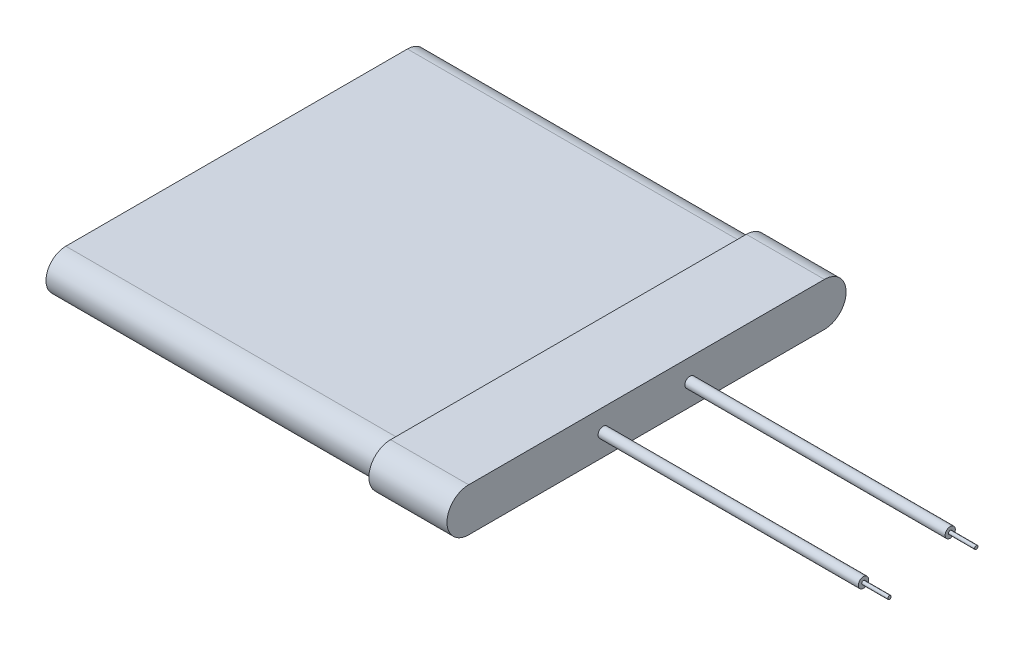
ISO-10303-21;
HEADER;
FILE_DESCRIPTION(('STEP AP214'),'2;1');
FILE_NAME('part.step','',(''),(''),'','','');
FILE_SCHEMA(('AUTOMOTIVE_DESIGN { 1 0 10303 214 1 1 1 1 }'));
ENDSEC;
DATA;
#1=APPLICATION_CONTEXT('core data for automotive mechanical design processes');
#2=APPLICATION_PROTOCOL_DEFINITION('international standard','automotive_design',2000,#1);
#3=PRODUCT_CONTEXT('',#1,'mechanical');
#4=PRODUCT('Part','Part','',(#3));
#5=PRODUCT_RELATED_PRODUCT_CATEGORY('part','',(#4));
#6=PRODUCT_DEFINITION_FORMATION('','',#4);
#7=PRODUCT_DEFINITION_CONTEXT('part definition',#1,'design');
#8=PRODUCT_DEFINITION('design','',#6,#7);
#9=PRODUCT_DEFINITION_SHAPE('','',#8);
#10=(LENGTH_UNIT() NAMED_UNIT(*) SI_UNIT(.MILLI.,.METRE.));
#11=(NAMED_UNIT(*) PLANE_ANGLE_UNIT() SI_UNIT($,.RADIAN.));
#12=(NAMED_UNIT(*) SI_UNIT($,.STERADIAN.) SOLID_ANGLE_UNIT());
#13=UNCERTAINTY_MEASURE_WITH_UNIT(LENGTH_MEASURE(1.E-05),#10,'distance_accuracy_value','');
#14=(GEOMETRIC_REPRESENTATION_CONTEXT(3) GLOBAL_UNCERTAINTY_ASSIGNED_CONTEXT((#13)) GLOBAL_UNIT_ASSIGNED_CONTEXT((#10,
#11,#12)) REPRESENTATION_CONTEXT('',''));
#15=CARTESIAN_POINT('',(0.,0.,0.));
#16=DIRECTION('',(0.,0.,1.));
#17=DIRECTION('',(1.,0.,0.));
#18=AXIS2_PLACEMENT_3D('',#15,#16,#17);
#19=CARTESIAN_POINT('',(30.,0.,25.));
#20=DIRECTION('',(1.,0.,0.));
#21=DIRECTION('',(0.,0.,-1.));
#22=AXIS2_PLACEMENT_3D('',#19,#20,#21);
#23=PLANE('',#22);
#24=CARTESIAN_POINT('',(30.,0.,-6.35));
#25=DIRECTION('',(1.,0.,0.));
#26=DIRECTION('',(0.,0.,-1.));
#27=AXIS2_PLACEMENT_3D('',#24,#25,#26);
#28=CIRCLE('',#27,0.7493);
#29=CARTESIAN_POINT('',(30.,0.,-5.6007));
#30=VERTEX_POINT('',#29);
#31=EDGE_CURVE('E157',#30,#30,#28,.T.);
#32=ORIENTED_EDGE('',*,*,#31,.F.);
#33=EDGE_LOOP('',(#32));
#34=FACE_BOUND('',#33,.T.);
#35=CARTESIAN_POINT('',(30.,0.,6.35));
#36=DIRECTION('',(1.,0.,0.));
#37=DIRECTION('',(0.,0.,-1.));
#38=AXIS2_PLACEMENT_3D('',#35,#36,#37);
#39=CIRCLE('',#38,0.7493);
#40=CARTESIAN_POINT('',(30.,0.,7.0993));
#41=VERTEX_POINT('',#40);
#42=EDGE_CURVE('E163',#41,#41,#39,.T.);
#43=ORIENTED_EDGE('',*,*,#42,.F.);
#44=EDGE_LOOP('',(#43));
#45=FACE_BOUND('',#44,.T.);
#46=CARTESIAN_POINT('',(30.,0.,-26.035));
#47=DIRECTION('',(1.,0.,0.));
#48=DIRECTION('',(0.,0.,-1.));
#49=AXIS2_PLACEMENT_3D('',#46,#47,#48);
#50=CIRCLE('',#49,3.175);
#51=CARTESIAN_POINT('',(30.,-3.17499999999999,-26.035));
#52=VERTEX_POINT('',#51);
#53=CARTESIAN_POINT('',(30.,3.17500000000001,-26.035));
#54=VERTEX_POINT('',#53);
#55=EDGE_CURVE('E133',#52,#54,#50,.T.);
#56=ORIENTED_EDGE('',*,*,#55,.T.);
#57=DIRECTION('',(0.,0.,1.));
#58=VECTOR('',#57,1.);
#59=CARTESIAN_POINT('',(30.,3.17500000000001,-26.035));
#60=LINE('',#59,#58);
#61=CARTESIAN_POINT('',(30.,3.17499999999999,26.035));
#62=VERTEX_POINT('',#61);
#63=EDGE_CURVE('E105',#54,#62,#60,.T.);
#64=ORIENTED_EDGE('',*,*,#63,.T.);
#65=CARTESIAN_POINT('',(30.,0.,26.035));
#66=DIRECTION('',(1.,0.,0.));
#67=DIRECTION('',(0.,0.,-1.));
#68=AXIS2_PLACEMENT_3D('',#65,#66,#67);
#69=CIRCLE('',#68,3.175);
#70=CARTESIAN_POINT('',(30.,-3.17500000000001,26.035));
#71=VERTEX_POINT('',#70);
#72=EDGE_CURVE('E128',#62,#71,#69,.T.);
#73=ORIENTED_EDGE('',*,*,#72,.T.);
#74=DIRECTION('',(0.,0.,1.));
#75=VECTOR('',#74,1.);
#76=CARTESIAN_POINT('',(30.,-3.17499999999999,-26.035));
#77=LINE('',#76,#75);
#78=EDGE_CURVE('E125',#52,#71,#77,.T.);
#79=ORIENTED_EDGE('',*,*,#78,.F.);
#80=EDGE_LOOP('',(#56,#64,#73,#79));
#81=FACE_BOUND('',#80,.T.);
#82=ADVANCED_FACE('F34',(#34,#45,#81),#23,.T.);
#83=CARTESIAN_POINT('',(68.1,0.,6.35));
#84=DIRECTION('',(-1.,0.,0.));
#85=DIRECTION('',(0.,0.,1.));
#86=AXIS2_PLACEMENT_3D('',#83,#84,#85);
#87=CYLINDRICAL_SURFACE('',#86,0.7493);
#88=CARTESIAN_POINT('',(68.1,0.,6.35));
#89=DIRECTION('',(1.,0.,0.));
#90=DIRECTION('',(0.,0.,-1.));
#91=AXIS2_PLACEMENT_3D('',#88,#89,#90);
#92=CIRCLE('',#91,0.7493);
#93=CARTESIAN_POINT('',(68.1,0.,7.0993));
#94=VERTEX_POINT('',#93);
#95=EDGE_CURVE('E166',#94,#94,#92,.T.);
#96=CARTESIAN_POINT('',(68.1,0.,7.0993));
#97=CARTESIAN_POINT('',(67.703125,0.,7.0993));
#98=CARTESIAN_POINT('',(67.30625,0.,7.0993));
#99=CARTESIAN_POINT('',(66.5125,0.,7.0993));
#100=CARTESIAN_POINT('',(66.115625,0.,7.0993));
#101=CARTESIAN_POINT('',(65.321875,0.,7.0993));
#102=CARTESIAN_POINT('',(64.925,0.,7.0993));
#103=CARTESIAN_POINT('',(64.13125,0.,7.0993));
#104=CARTESIAN_POINT('',(63.734375,0.,7.0993));
#105=CARTESIAN_POINT('',(62.940625,0.,7.0993));
#106=CARTESIAN_POINT('',(62.54375,0.,7.0993));
#107=CARTESIAN_POINT('',(61.75,0.,7.0993));
#108=CARTESIAN_POINT('',(61.353125,0.,7.0993));
#109=CARTESIAN_POINT('',(60.559375,0.,7.0993));
#110=CARTESIAN_POINT('',(60.1625,0.,7.0993));
#111=CARTESIAN_POINT('',(59.36875,0.,7.0993));
#112=CARTESIAN_POINT('',(58.971875,0.,7.0993));
#113=CARTESIAN_POINT('',(58.178125,0.,7.0993));
#114=CARTESIAN_POINT('',(57.78125,0.,7.0993));
#115=CARTESIAN_POINT('',(56.9875,0.,7.0993));
#116=CARTESIAN_POINT('',(56.590625,0.,7.0993));
#117=CARTESIAN_POINT('',(55.796875,0.,7.0993));
#118=CARTESIAN_POINT('',(55.4,0.,7.0993));
#119=CARTESIAN_POINT('',(54.60625,0.,7.0993));
#120=CARTESIAN_POINT('',(54.209375,0.,7.0993));
#121=CARTESIAN_POINT('',(53.415625,0.,7.0993));
#122=CARTESIAN_POINT('',(53.01875,0.,7.0993));
#123=CARTESIAN_POINT('',(52.225,0.,7.0993));
#124=CARTESIAN_POINT('',(51.828125,0.,7.0993));
#125=CARTESIAN_POINT('',(51.034375,0.,7.0993));
#126=CARTESIAN_POINT('',(50.6375,0.,7.0993));
#127=CARTESIAN_POINT('',(49.84375,0.,7.0993));
#128=CARTESIAN_POINT('',(49.446875,0.,7.0993));
#129=CARTESIAN_POINT('',(48.653125,0.,7.0993));
#130=CARTESIAN_POINT('',(48.25625,0.,7.0993));
#131=CARTESIAN_POINT('',(47.4625,0.,7.0993));
#132=CARTESIAN_POINT('',(47.065625,0.,7.0993));
#133=CARTESIAN_POINT('',(46.271875,0.,7.0993));
#134=CARTESIAN_POINT('',(45.875,0.,7.0993));
#135=CARTESIAN_POINT('',(45.08125,0.,7.0993));
#136=CARTESIAN_POINT('',(44.684375,0.,7.0993));
#137=CARTESIAN_POINT('',(43.890625,0.,7.0993));
#138=CARTESIAN_POINT('',(43.49375,0.,7.0993));
#139=CARTESIAN_POINT('',(42.7,0.,7.0993));
#140=CARTESIAN_POINT('',(42.303125,0.,7.0993));
#141=CARTESIAN_POINT('',(41.509375,0.,7.0993));
#142=CARTESIAN_POINT('',(41.1125,0.,7.0993));
#143=CARTESIAN_POINT('',(40.31875,0.,7.0993));
#144=CARTESIAN_POINT('',(39.921875,0.,7.0993));
#145=CARTESIAN_POINT('',(39.128125,0.,7.0993));
#146=CARTESIAN_POINT('',(38.73125,0.,7.0993));
#147=CARTESIAN_POINT('',(37.9375,0.,7.0993));
#148=CARTESIAN_POINT('',(37.540625,0.,7.0993));
#149=CARTESIAN_POINT('',(36.746875,0.,7.0993));
#150=CARTESIAN_POINT('',(36.35,0.,7.0993));
#151=CARTESIAN_POINT('',(35.55625,0.,7.0993));
#152=CARTESIAN_POINT('',(35.159375,0.,7.0993));
#153=CARTESIAN_POINT('',(34.365625,0.,7.0993));
#154=CARTESIAN_POINT('',(33.96875,0.,7.0993));
#155=CARTESIAN_POINT('',(33.175,0.,7.0993));
#156=CARTESIAN_POINT('',(32.778125,0.,7.0993));
#157=CARTESIAN_POINT('',(31.984375,0.,7.0993));
#158=CARTESIAN_POINT('',(31.5875,0.,7.0993));
#159=CARTESIAN_POINT('',(30.79375,0.,7.0993));
#160=CARTESIAN_POINT('',(30.396875,0.,7.0993));
#161=CARTESIAN_POINT('',(30.,0.,7.0993));
#162=B_SPLINE_CURVE_WITH_KNOTS('',3,(#96,#97,#98,#99,#100,#101,#102,#103,#104,#105,#106,#107,
#108,#109,#110,#111,#112,#113,#114,#115,#116,#117,#118,#119,#120,#121,#122,#123,#124,#125,#126,
#127,#128,#129,#130,#131,#132,#133,#134,#135,#136,#137,#138,#139,#140,#141,#142,#143,#144,#145,
#146,#147,#148,#149,#150,#151,#152,#153,#154,#155,#156,#157,#158,#159,#160,#161),.UNSPECIFIED.,
.F.,.F.,(4,2,2,2,2,2,2,2,2,2,2,2,2,2,2,2,2,2,2,2,2,2,2,2,2,2,2,2,2,2,2,2,4),(0.,1.190625,
2.38125,3.571875,4.7625,5.953125,7.14375,8.334375,9.52500000000001,10.715625,11.90625,13.096875,
14.2875,15.478125,16.66875,17.859375,19.05,20.240625,21.43125,22.621875,23.8125,25.003125,
26.19375,27.384375,28.575,29.765625,30.95625,32.146875,33.3375,34.528125,35.71875,36.909375,
38.1),.UNSPECIFIED.);
#163=EDGE_CURVE('BSEAM214',#94,#41,#162,.T.);
#164=ORIENTED_EDGE('',*,*,#95,.F.);
#165=ORIENTED_EDGE('',*,*,#42,.T.);
#166=ORIENTED_EDGE('',*,*,#163,.T.);
#167=ORIENTED_EDGE('',*,*,#163,.F.);
#168=EDGE_LOOP('',(#164,#166,#165,#167));
#169=FACE_BOUND('',#168,.T.);
#170=ADVANCED_FACE('F214',(#169),#87,.T.);
#171=CARTESIAN_POINT('',(68.1,0.,6.35));
#172=DIRECTION('',(1.,0.,0.));
#173=DIRECTION('',(0.,0.,-1.));
#174=AXIS2_PLACEMENT_3D('',#171,#172,#173);
#175=PLANE('',#174);
#176=CARTESIAN_POINT('',(68.1,0.,6.35));
#177=DIRECTION('',(1.,0.,0.));
#178=DIRECTION('',(0.,0.,-1.));
#179=AXIS2_PLACEMENT_3D('',#176,#177,#178);
#180=CIRCLE('',#179,0.254);
#181=CARTESIAN_POINT('',(68.1,0.,6.096));
#182=VERTEX_POINT('',#181);
#183=EDGE_CURVE('E151',#182,#182,#180,.T.);
#184=ORIENTED_EDGE('',*,*,#183,.F.);
#185=EDGE_LOOP('',(#184));
#186=FACE_BOUND('',#185,.T.);
#187=ORIENTED_EDGE('',*,*,#95,.T.);
#188=EDGE_LOOP('',(#187));
#189=FACE_BOUND('',#188,.T.);
#190=ADVANCED_FACE('F220',(#186,#189),#175,.T.);
#191=CARTESIAN_POINT('',(68.1,0.,-6.35));
#192=DIRECTION('',(-1.,0.,0.));
#193=DIRECTION('',(0.,0.,1.));
#194=AXIS2_PLACEMENT_3D('',#191,#192,#193);
#195=CYLINDRICAL_SURFACE('',#194,0.7493);
#196=CARTESIAN_POINT('',(68.1,0.,-6.35));
#197=DIRECTION('',(1.,0.,0.));
#198=DIRECTION('',(0.,0.,-1.));
#199=AXIS2_PLACEMENT_3D('',#196,#197,#198);
#200=CIRCLE('',#199,0.7493);
#201=CARTESIAN_POINT('',(68.1,0.,-5.6007));
#202=VERTEX_POINT('',#201);
#203=EDGE_CURVE('E160',#202,#202,#200,.T.);
#204=CARTESIAN_POINT('',(68.1,0.,-5.6007));
#205=CARTESIAN_POINT('',(67.703125,0.,-5.6007));
#206=CARTESIAN_POINT('',(67.30625,0.,-5.6007));
#207=CARTESIAN_POINT('',(66.5125,0.,-5.6007));
#208=CARTESIAN_POINT('',(66.115625,0.,-5.6007));
#209=CARTESIAN_POINT('',(65.321875,0.,-5.6007));
#210=CARTESIAN_POINT('',(64.925,0.,-5.6007));
#211=CARTESIAN_POINT('',(64.13125,0.,-5.6007));
#212=CARTESIAN_POINT('',(63.734375,0.,-5.6007));
#213=CARTESIAN_POINT('',(62.940625,0.,-5.6007));
#214=CARTESIAN_POINT('',(62.54375,0.,-5.6007));
#215=CARTESIAN_POINT('',(61.75,0.,-5.6007));
#216=CARTESIAN_POINT('',(61.353125,0.,-5.6007));
#217=CARTESIAN_POINT('',(60.559375,0.,-5.6007));
#218=CARTESIAN_POINT('',(60.1625,0.,-5.6007));
#219=CARTESIAN_POINT('',(59.36875,0.,-5.6007));
#220=CARTESIAN_POINT('',(58.971875,0.,-5.6007));
#221=CARTESIAN_POINT('',(58.178125,0.,-5.6007));
#222=CARTESIAN_POINT('',(57.78125,0.,-5.6007));
#223=CARTESIAN_POINT('',(56.9875,0.,-5.6007));
#224=CARTESIAN_POINT('',(56.590625,0.,-5.6007));
#225=CARTESIAN_POINT('',(55.796875,0.,-5.6007));
#226=CARTESIAN_POINT('',(55.4,0.,-5.6007));
#227=CARTESIAN_POINT('',(54.60625,0.,-5.6007));
#228=CARTESIAN_POINT('',(54.209375,0.,-5.6007));
#229=CARTESIAN_POINT('',(53.415625,0.,-5.6007));
#230=CARTESIAN_POINT('',(53.01875,0.,-5.6007));
#231=CARTESIAN_POINT('',(52.225,0.,-5.6007));
#232=CARTESIAN_POINT('',(51.828125,0.,-5.6007));
#233=CARTESIAN_POINT('',(51.034375,0.,-5.6007));
#234=CARTESIAN_POINT('',(50.6375,0.,-5.6007));
#235=CARTESIAN_POINT('',(49.84375,0.,-5.6007));
#236=CARTESIAN_POINT('',(49.446875,0.,-5.6007));
#237=CARTESIAN_POINT('',(48.653125,0.,-5.6007));
#238=CARTESIAN_POINT('',(48.25625,0.,-5.6007));
#239=CARTESIAN_POINT('',(47.4625,0.,-5.6007));
#240=CARTESIAN_POINT('',(47.065625,0.,-5.6007));
#241=CARTESIAN_POINT('',(46.271875,0.,-5.6007));
#242=CARTESIAN_POINT('',(45.875,0.,-5.6007));
#243=CARTESIAN_POINT('',(45.08125,0.,-5.6007));
#244=CARTESIAN_POINT('',(44.684375,0.,-5.6007));
#245=CARTESIAN_POINT('',(43.890625,0.,-5.6007));
#246=CARTESIAN_POINT('',(43.49375,0.,-5.6007));
#247=CARTESIAN_POINT('',(42.7,0.,-5.6007));
#248=CARTESIAN_POINT('',(42.303125,0.,-5.6007));
#249=CARTESIAN_POINT('',(41.509375,0.,-5.6007));
#250=CARTESIAN_POINT('',(41.1125,0.,-5.6007));
#251=CARTESIAN_POINT('',(40.31875,0.,-5.6007));
#252=CARTESIAN_POINT('',(39.921875,0.,-5.6007));
#253=CARTESIAN_POINT('',(39.128125,0.,-5.6007));
#254=CARTESIAN_POINT('',(38.73125,0.,-5.6007));
#255=CARTESIAN_POINT('',(37.9375,0.,-5.6007));
#256=CARTESIAN_POINT('',(37.540625,0.,-5.6007));
#257=CARTESIAN_POINT('',(36.746875,0.,-5.6007));
#258=CARTESIAN_POINT('',(36.35,0.,-5.6007));
#259=CARTESIAN_POINT('',(35.55625,0.,-5.6007));
#260=CARTESIAN_POINT('',(35.159375,0.,-5.6007));
#261=CARTESIAN_POINT('',(34.365625,0.,-5.6007));
#262=CARTESIAN_POINT('',(33.96875,0.,-5.6007));
#263=CARTESIAN_POINT('',(33.175,0.,-5.6007));
#264=CARTESIAN_POINT('',(32.778125,0.,-5.6007));
#265=CARTESIAN_POINT('',(31.984375,0.,-5.6007));
#266=CARTESIAN_POINT('',(31.5875,0.,-5.6007));
#267=CARTESIAN_POINT('',(30.79375,0.,-5.6007));
#268=CARTESIAN_POINT('',(30.396875,0.,-5.6007));
#269=CARTESIAN_POINT('',(30.,0.,-5.6007));
#270=B_SPLINE_CURVE_WITH_KNOTS('',3,(#204,#205,#206,#207,#208,#209,#210,#211,#212,#213,#214,
#215,#216,#217,#218,#219,#220,#221,#222,#223,#224,#225,#226,#227,#228,#229,#230,#231,#232,#233,
#234,#235,#236,#237,#238,#239,#240,#241,#242,#243,#244,#245,#246,#247,#248,#249,#250,#251,#252,
#253,#254,#255,#256,#257,#258,#259,#260,#261,#262,#263,#264,#265,#266,#267,#268,#269),
.UNSPECIFIED.,.F.,.F.,(4,2,2,2,2,2,2,2,2,2,2,2,2,2,2,2,2,2,2,2,2,2,2,2,2,2,2,2,2,2,2,2,4),(0.,
1.190625,2.38125,3.571875,4.7625,5.953125,7.14375,8.334375,9.52500000000001,10.715625,11.90625,
13.096875,14.2875,15.478125,16.66875,17.859375,19.05,20.240625,21.43125,22.621875,23.8125,
25.003125,26.19375,27.384375,28.575,29.765625,30.95625,32.146875,33.3375,34.528125,35.71875,
36.909375,38.1),.UNSPECIFIED.);
#271=EDGE_CURVE('BSEAM326',#202,#30,#270,.T.);
#272=ORIENTED_EDGE('',*,*,#203,.F.);
#273=ORIENTED_EDGE('',*,*,#31,.T.);
#274=ORIENTED_EDGE('',*,*,#271,.T.);
#275=ORIENTED_EDGE('',*,*,#271,.F.);
#276=EDGE_LOOP('',(#272,#274,#273,#275));
#277=FACE_BOUND('',#276,.T.);
#278=ADVANCED_FACE('F326',(#277),#195,.T.);
#279=CARTESIAN_POINT('',(68.1,0.,-6.35));
#280=DIRECTION('',(1.,0.,0.));
#281=DIRECTION('',(0.,0.,-1.));
#282=AXIS2_PLACEMENT_3D('',#279,#280,#281);
#283=PLANE('',#282);
#284=CARTESIAN_POINT('',(68.1,0.,-6.35));
#285=DIRECTION('',(1.,0.,0.));
#286=DIRECTION('',(0.,0.,-1.));
#287=AXIS2_PLACEMENT_3D('',#284,#285,#286);
#288=CIRCLE('',#287,0.254);
#289=CARTESIAN_POINT('',(68.1,0.,-6.604));
#290=VERTEX_POINT('',#289);
#291=EDGE_CURVE('E147',#290,#290,#288,.T.);
#292=ORIENTED_EDGE('',*,*,#291,.F.);
#293=EDGE_LOOP('',(#292));
#294=FACE_BOUND('',#293,.T.);
#295=ORIENTED_EDGE('',*,*,#203,.T.);
#296=EDGE_LOOP('',(#295));
#297=FACE_BOUND('',#296,.T.);
#298=ADVANCED_FACE('F320',(#294,#297),#283,.T.);
#299=CARTESIAN_POINT('',(71.91,0.,6.35));
#300=DIRECTION('',(-1.,0.,0.));
#301=DIRECTION('',(0.,0.,1.));
#302=AXIS2_PLACEMENT_3D('',#299,#300,#301);
#303=CYLINDRICAL_SURFACE('',#302,0.254);
#304=CARTESIAN_POINT('',(71.91,0.,6.35));
#305=DIRECTION('',(1.,0.,0.));
#306=DIRECTION('',(0.,0.,-1.));
#307=AXIS2_PLACEMENT_3D('',#304,#305,#306);
#308=CIRCLE('',#307,0.254);
#309=CARTESIAN_POINT('',(71.91,0.,6.096));
#310=VERTEX_POINT('',#309);
#311=EDGE_CURVE('E154',#310,#310,#308,.T.);
#312=ORIENTED_EDGE('',*,*,#311,.F.);
#313=EDGE_LOOP('',(#312));
#314=FACE_BOUND('',#313,.T.);
#315=ORIENTED_EDGE('',*,*,#183,.T.);
#316=EDGE_LOOP('',(#315));
#317=FACE_BOUND('',#316,.T.);
#318=ADVANCED_FACE('F325',(#314,#317),#303,.T.);
#319=CARTESIAN_POINT('',(71.91,0.,6.35));
#320=DIRECTION('',(1.,0.,0.));
#321=DIRECTION('',(0.,0.,-1.));
#322=AXIS2_PLACEMENT_3D('',#319,#320,#321);
#323=PLANE('',#322);
#324=ORIENTED_EDGE('',*,*,#311,.T.);
#325=EDGE_LOOP('',(#324));
#326=FACE_BOUND('',#325,.T.);
#327=ADVANCED_FACE('F313',(#326),#323,.T.);
#328=CARTESIAN_POINT('',(71.91,0.,-6.35));
#329=DIRECTION('',(-1.,0.,0.));
#330=DIRECTION('',(0.,0.,1.));
#331=AXIS2_PLACEMENT_3D('',#328,#329,#330);
#332=CYLINDRICAL_SURFACE('',#331,0.254);
#333=CARTESIAN_POINT('',(71.91,0.,-6.35));
#334=DIRECTION('',(1.,0.,0.));
#335=DIRECTION('',(0.,0.,-1.));
#336=AXIS2_PLACEMENT_3D('',#333,#334,#335);
#337=CIRCLE('',#336,0.254);
#338=CARTESIAN_POINT('',(71.91,0.,-6.604));
#339=VERTEX_POINT('',#338);
#340=EDGE_CURVE('E148',#339,#339,#337,.T.);
#341=ORIENTED_EDGE('',*,*,#340,.F.);
#342=EDGE_LOOP('',(#341));
#343=FACE_BOUND('',#342,.T.);
#344=ORIENTED_EDGE('',*,*,#291,.T.);
#345=EDGE_LOOP('',(#344));
#346=FACE_BOUND('',#345,.T.);
#347=ADVANCED_FACE('F209',(#343,#346),#332,.T.);
#348=CARTESIAN_POINT('',(71.91,0.,-6.35));
#349=DIRECTION('',(1.,0.,0.));
#350=DIRECTION('',(0.,0.,-1.));
#351=AXIS2_PLACEMENT_3D('',#348,#349,#350);
#352=PLANE('',#351);
#353=ORIENTED_EDGE('',*,*,#340,.T.);
#354=EDGE_LOOP('',(#353));
#355=FACE_BOUND('',#354,.T.);
#356=ADVANCED_FACE('F201',(#355),#352,.T.);
#357=CARTESIAN_POINT('',(18.57,0.,-26.035));
#358=DIRECTION('',(1.,0.,0.));
#359=DIRECTION('',(0.,0.,-1.));
#360=AXIS2_PLACEMENT_3D('',#357,#358,#359);
#361=PLANE('',#360);
#362=CARTESIAN_POINT('',(18.57,0.,-26.035));
#363=DIRECTION('',(1.,0.,0.));
#364=DIRECTION('',(0.,0.,-1.));
#365=AXIS2_PLACEMENT_3D('',#362,#363,#364);
#366=CIRCLE('',#365,3.175);
#367=CARTESIAN_POINT('',(18.57,-3.17499999999999,-26.035));
#368=VERTEX_POINT('',#367);
#369=CARTESIAN_POINT('',(18.57,3.17500000000001,-26.035));
#370=VERTEX_POINT('',#369);
#371=EDGE_CURVE('E118',#368,#370,#366,.T.);
#372=ORIENTED_EDGE('',*,*,#371,.F.);
#373=DIRECTION('',(0.,0.,1.));
#374=VECTOR('',#373,1.);
#375=CARTESIAN_POINT('',(18.57,-3.17499999999999,-26.035));
#376=LINE('',#375,#374);
#377=CARTESIAN_POINT('',(18.57,-3.17500000000001,26.035));
#378=VERTEX_POINT('',#377);
#379=EDGE_CURVE('E111',#368,#378,#376,.T.);
#380=ORIENTED_EDGE('',*,*,#379,.T.);
#381=CARTESIAN_POINT('',(18.57,0.,26.035));
#382=DIRECTION('',(1.,0.,0.));
#383=DIRECTION('',(0.,0.,-1.));
#384=AXIS2_PLACEMENT_3D('',#381,#382,#383);
#385=CIRCLE('',#384,3.175);
#386=CARTESIAN_POINT('',(18.57,3.17499999999999,26.035));
#387=VERTEX_POINT('',#386);
#388=EDGE_CURVE('E120',#387,#378,#385,.T.);
#389=ORIENTED_EDGE('',*,*,#388,.F.);
#390=DIRECTION('',(0.,0.,1.));
#391=VECTOR('',#390,1.);
#392=CARTESIAN_POINT('',(18.57,3.17500000000001,-26.035));
#393=LINE('',#392,#391);
#394=EDGE_CURVE('E103',#370,#387,#393,.T.);
#395=ORIENTED_EDGE('',*,*,#394,.F.);
#396=EDGE_LOOP('',(#372,#380,#389,#395));
#397=FACE_BOUND('',#396,.T.);
#398=DIRECTION('',(0.,0.,1.));
#399=VECTOR('',#398,1.);
#400=CARTESIAN_POINT('',(18.57,2.9,25.));
#401=LINE('',#400,#399);
#402=CARTESIAN_POINT('',(18.57,2.90000000000001,-25.));
#403=VERTEX_POINT('',#402);
#404=CARTESIAN_POINT('',(18.57,2.9,25.));
#405=VERTEX_POINT('',#404);
#406=EDGE_CURVE('E11',#403,#405,#401,.T.);
#407=ORIENTED_EDGE('',*,*,#406,.T.);
#408=CARTESIAN_POINT('',(18.57,0.,25.));
#409=DIRECTION('',(1.,0.,0.));
#410=DIRECTION('',(0.,0.,-1.));
#411=AXIS2_PLACEMENT_3D('',#408,#409,#410);
#412=CIRCLE('',#411,2.9);
#413=CARTESIAN_POINT('',(18.57,-2.9,25.));
#414=VERTEX_POINT('',#413);
#415=EDGE_CURVE('E144',#405,#414,#412,.T.);
#416=ORIENTED_EDGE('',*,*,#415,.T.);
#417=DIRECTION('',(0.,0.,-1.));
#418=VECTOR('',#417,1.);
#419=CARTESIAN_POINT('',(18.57,-2.9,25.));
#420=LINE('',#419,#418);
#421=CARTESIAN_POINT('',(18.57,-2.89999999999999,-25.));
#422=VERTEX_POINT('',#421);
#423=EDGE_CURVE('E49',#414,#422,#420,.T.);
#424=ORIENTED_EDGE('',*,*,#423,.T.);
#425=CARTESIAN_POINT('',(18.57,0.,-25.));
#426=DIRECTION('',(1.,0.,0.));
#427=DIRECTION('',(0.,0.,-1.));
#428=AXIS2_PLACEMENT_3D('',#425,#426,#427);
#429=CIRCLE('',#428,2.9);
#430=EDGE_CURVE('E57',#422,#403,#429,.T.);
#431=ORIENTED_EDGE('',*,*,#430,.T.);
#432=EDGE_LOOP('',(#407,#416,#424,#431));
#433=FACE_BOUND('',#432,.T.);
#434=ADVANCED_FACE('F116',(#397,#433),#361,.F.);
#435=CARTESIAN_POINT('',(18.57,0.,-26.035));
#436=DIRECTION('',(1.,0.,0.));
#437=DIRECTION('',(0.,0.,-1.));
#438=AXIS2_PLACEMENT_3D('',#435,#436,#437);
#439=CYLINDRICAL_SURFACE('',#438,3.175);
#440=ORIENTED_EDGE('',*,*,#55,.F.);
#441=DIRECTION('',(1.,0.,0.));
#442=VECTOR('',#441,1.);
#443=CARTESIAN_POINT('',(18.57,-3.17499999999999,-26.035));
#444=LINE('',#443,#442);
#445=EDGE_CURVE('E123',#368,#52,#444,.T.);
#446=ORIENTED_EDGE('',*,*,#445,.F.);
#447=ORIENTED_EDGE('',*,*,#371,.T.);
#448=DIRECTION('',(1.,0.,0.));
#449=VECTOR('',#448,1.);
#450=CARTESIAN_POINT('',(18.57,3.17500000000001,-26.035));
#451=LINE('',#450,#449);
#452=EDGE_CURVE('E100',#370,#54,#451,.T.);
#453=ORIENTED_EDGE('',*,*,#452,.T.);
#454=EDGE_LOOP('',(#440,#446,#447,#453));
#455=FACE_BOUND('',#454,.T.);
#456=ADVANCED_FACE('F122',(#455),#439,.T.);
#457=CARTESIAN_POINT('',(18.57,-3.17499999999999,-26.035));
#458=DIRECTION('',(0.,1.,0.));
#459=DIRECTION('',(0.,0.,1.));
#460=AXIS2_PLACEMENT_3D('',#457,#458,#459);
#461=PLANE('',#460);
#462=ORIENTED_EDGE('',*,*,#78,.T.);
#463=DIRECTION('',(1.,0.,0.));
#464=VECTOR('',#463,1.);
#465=CARTESIAN_POINT('',(18.57,-3.17500000000001,26.035));
#466=LINE('',#465,#464);
#467=EDGE_CURVE('E139',#378,#71,#466,.T.);
#468=ORIENTED_EDGE('',*,*,#467,.F.);
#469=ORIENTED_EDGE('',*,*,#379,.F.);
#470=ORIENTED_EDGE('',*,*,#445,.T.);
#471=EDGE_LOOP('',(#462,#468,#469,#470));
#472=FACE_BOUND('',#471,.T.);
#473=ADVANCED_FACE('F207',(#472),#461,.F.);
#474=CARTESIAN_POINT('',(18.57,0.,26.035));
#475=DIRECTION('',(1.,0.,0.));
#476=DIRECTION('',(0.,0.,-1.));
#477=AXIS2_PLACEMENT_3D('',#474,#475,#476);
#478=CYLINDRICAL_SURFACE('',#477,3.175);
#479=ORIENTED_EDGE('',*,*,#72,.F.);
#480=DIRECTION('',(1.,0.,0.));
#481=VECTOR('',#480,1.);
#482=CARTESIAN_POINT('',(18.57,3.17499999999999,26.035));
#483=LINE('',#482,#481);
#484=EDGE_CURVE('E110',#387,#62,#483,.T.);
#485=ORIENTED_EDGE('',*,*,#484,.F.);
#486=ORIENTED_EDGE('',*,*,#388,.T.);
#487=ORIENTED_EDGE('',*,*,#467,.T.);
#488=EDGE_LOOP('',(#479,#485,#486,#487));
#489=FACE_BOUND('',#488,.T.);
#490=ADVANCED_FACE('F263',(#489),#478,.T.);
#491=CARTESIAN_POINT('',(18.57,3.17500000000001,-26.035));
#492=DIRECTION('',(0.,1.,0.));
#493=DIRECTION('',(0.,0.,1.));
#494=AXIS2_PLACEMENT_3D('',#491,#492,#493);
#495=PLANE('',#494);
#496=ORIENTED_EDGE('',*,*,#63,.F.);
#497=ORIENTED_EDGE('',*,*,#452,.F.);
#498=ORIENTED_EDGE('',*,*,#394,.T.);
#499=ORIENTED_EDGE('',*,*,#484,.T.);
#500=EDGE_LOOP('',(#496,#497,#498,#499));
#501=FACE_BOUND('',#500,.T.);
#502=ADVANCED_FACE('F102',(#501),#495,.T.);
#503=CARTESIAN_POINT('',(-30.,0.,25.));
#504=DIRECTION('',(1.,0.,0.));
#505=DIRECTION('',(0.,0.,-1.));
#506=AXIS2_PLACEMENT_3D('',#503,#504,#505);
#507=PLANE('',#506);
#508=CARTESIAN_POINT('',(-30.,0.,25.));
#509=DIRECTION('',(1.,0.,0.));
#510=DIRECTION('',(0.,0.,-1.));
#511=AXIS2_PLACEMENT_3D('',#508,#509,#510);
#512=CIRCLE('',#511,2.9);
#513=CARTESIAN_POINT('',(-30.,2.9,25.));
#514=VERTEX_POINT('',#513);
#515=CARTESIAN_POINT('',(-30.,-2.9,25.));
#516=VERTEX_POINT('',#515);
#517=EDGE_CURVE('E169',#514,#516,#512,.T.);
#518=ORIENTED_EDGE('',*,*,#517,.F.);
#519=DIRECTION('',(0.,0.,1.));
#520=VECTOR('',#519,1.);
#521=CARTESIAN_POINT('',(-30.,2.9,25.));
#522=LINE('',#521,#520);
#523=CARTESIAN_POINT('',(-30.,2.90000000000001,-25.));
#524=VERTEX_POINT('',#523);
#525=EDGE_CURVE('E180',#524,#514,#522,.T.);
#526=ORIENTED_EDGE('',*,*,#525,.F.);
#527=CARTESIAN_POINT('',(-30.,0.,-25.));
#528=DIRECTION('',(1.,0.,0.));
#529=DIRECTION('',(0.,0.,-1.));
#530=AXIS2_PLACEMENT_3D('',#527,#528,#529);
#531=CIRCLE('',#530,2.9);
#532=CARTESIAN_POINT('',(-30.,-2.89999999999999,-25.));
#533=VERTEX_POINT('',#532);
#534=EDGE_CURVE('E177',#533,#524,#531,.T.);
#535=ORIENTED_EDGE('',*,*,#534,.F.);
#536=DIRECTION('',(0.,0.,-1.));
#537=VECTOR('',#536,1.);
#538=CARTESIAN_POINT('',(-30.,-2.9,25.));
#539=LINE('',#538,#537);
#540=EDGE_CURVE('E174',#516,#533,#539,.T.);
#541=ORIENTED_EDGE('',*,*,#540,.F.);
#542=EDGE_LOOP('',(#518,#526,#535,#541));
#543=FACE_BOUND('',#542,.T.);
#544=ADVANCED_FACE('F195',(#543),#507,.F.);
#545=CARTESIAN_POINT('',(30.,2.9,25.));
#546=DIRECTION('',(0.,-1.,0.));
#547=DIRECTION('',(0.,0.,-1.));
#548=AXIS2_PLACEMENT_3D('',#545,#546,#547);
#549=PLANE('',#548);
#550=ORIENTED_EDGE('',*,*,#406,.F.);
#551=DIRECTION('',(-1.,0.,0.));
#552=VECTOR('',#551,1.);
#553=CARTESIAN_POINT('',(30.,2.90000000000001,-25.));
#554=LINE('',#553,#552);
#555=EDGE_CURVE('E185',#403,#524,#554,.T.);
#556=ORIENTED_EDGE('',*,*,#555,.T.);
#557=ORIENTED_EDGE('',*,*,#525,.T.);
#558=DIRECTION('',(-1.,0.,0.));
#559=VECTOR('',#558,1.);
#560=CARTESIAN_POINT('',(30.,2.9,25.));
#561=LINE('',#560,#559);
#562=EDGE_CURVE('E183',#405,#514,#561,.T.);
#563=ORIENTED_EDGE('',*,*,#562,.F.);
#564=EDGE_LOOP('',(#550,#556,#557,#563));
#565=FACE_BOUND('',#564,.T.);
#566=ADVANCED_FACE('F198',(#565),#549,.F.);
#567=CARTESIAN_POINT('',(30.,0.,-25.));
#568=DIRECTION('',(-1.,0.,0.));
#569=DIRECTION('',(0.,0.,1.));
#570=AXIS2_PLACEMENT_3D('',#567,#568,#569);
#571=CYLINDRICAL_SURFACE('',#570,2.9);
#572=ORIENTED_EDGE('',*,*,#430,.F.);
#573=DIRECTION('',(-1.,0.,0.));
#574=VECTOR('',#573,1.);
#575=CARTESIAN_POINT('',(30.,-2.89999999999999,-25.));
#576=LINE('',#575,#574);
#577=EDGE_CURVE('E187',#422,#533,#576,.T.);
#578=ORIENTED_EDGE('',*,*,#577,.T.);
#579=ORIENTED_EDGE('',*,*,#534,.T.);
#580=ORIENTED_EDGE('',*,*,#555,.F.);
#581=EDGE_LOOP('',(#572,#578,#579,#580));
#582=FACE_BOUND('',#581,.T.);
#583=ADVANCED_FACE('F199',(#582),#571,.T.);
#584=CARTESIAN_POINT('',(30.,-2.9,25.));
#585=DIRECTION('',(0.,1.,0.));
#586=DIRECTION('',(0.,0.,1.));
#587=AXIS2_PLACEMENT_3D('',#584,#585,#586);
#588=PLANE('',#587);
#589=ORIENTED_EDGE('',*,*,#423,.F.);
#590=DIRECTION('',(-1.,0.,0.));
#591=VECTOR('',#590,1.);
#592=CARTESIAN_POINT('',(30.,-2.9,25.));
#593=LINE('',#592,#591);
#594=EDGE_CURVE('E42',#414,#516,#593,.T.);
#595=ORIENTED_EDGE('',*,*,#594,.T.);
#596=ORIENTED_EDGE('',*,*,#540,.T.);
#597=ORIENTED_EDGE('',*,*,#577,.F.);
#598=EDGE_LOOP('',(#589,#595,#596,#597));
#599=FACE_BOUND('',#598,.T.);
#600=ADVANCED_FACE('F189',(#599),#588,.F.);
#601=CARTESIAN_POINT('',(30.,0.,25.));
#602=DIRECTION('',(-1.,0.,0.));
#603=DIRECTION('',(0.,0.,1.));
#604=AXIS2_PLACEMENT_3D('',#601,#602,#603);
#605=CYLINDRICAL_SURFACE('',#604,2.9);
#606=ORIENTED_EDGE('',*,*,#415,.F.);
#607=ORIENTED_EDGE('',*,*,#562,.T.);
#608=ORIENTED_EDGE('',*,*,#517,.T.);
#609=ORIENTED_EDGE('',*,*,#594,.F.);
#610=EDGE_LOOP('',(#606,#607,#608,#609));
#611=FACE_BOUND('',#610,.T.);
#612=ADVANCED_FACE('F36',(#611),#605,.T.);
#613=CLOSED_SHELL('',(#82,#170,#190,#278,#298,#318,#327,#347,#356,#434,#456,#473,#490,#502,#544,
#566,#583,#600,#612));
#614=MANIFOLD_SOLID_BREP('B2',#613);
#615=ADVANCED_BREP_SHAPE_REPRESENTATION('',(#18,#614),#14);
#616=SHAPE_DEFINITION_REPRESENTATION(#9,#615);
ENDSEC;
END-ISO-10303-21;
